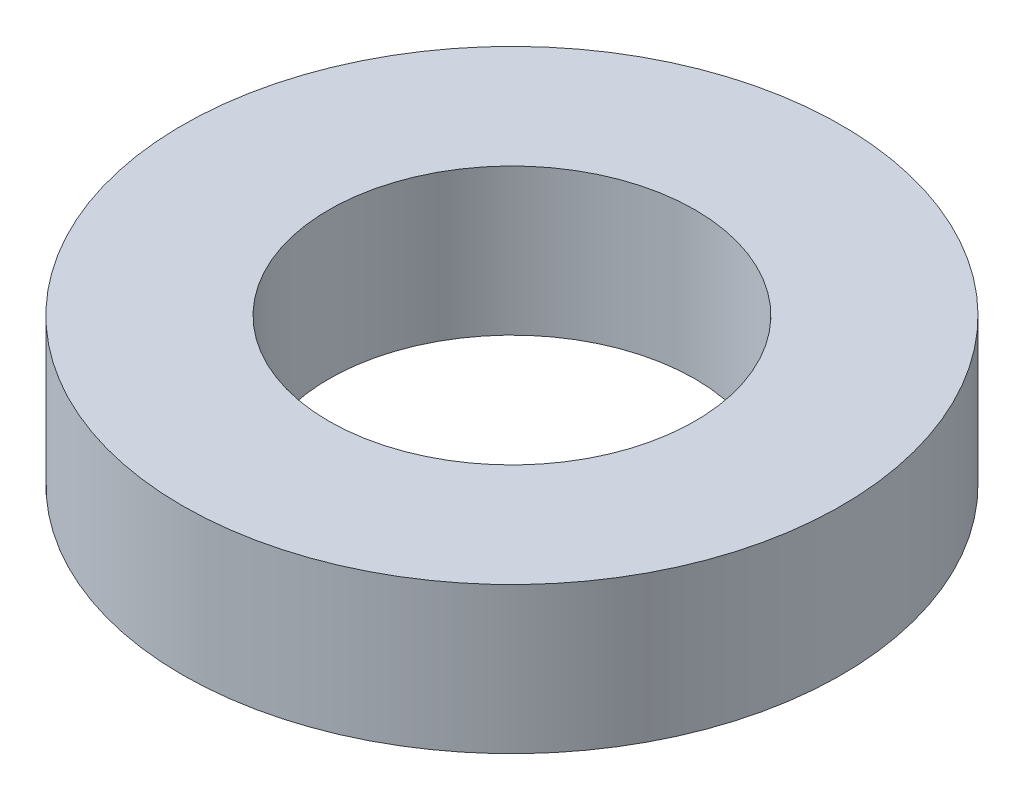
ISO-10303-21;
HEADER;
FILE_DESCRIPTION(('STEP AP214'),'2;1');
FILE_NAME('part.step','',(''),(''),'','','');
FILE_SCHEMA(('AUTOMOTIVE_DESIGN { 1 0 10303 214 1 1 1 1 }'));
ENDSEC;
DATA;
#1=APPLICATION_CONTEXT('core data for automotive mechanical design processes');
#2=APPLICATION_PROTOCOL_DEFINITION('international standard','automotive_design',2000,#1);
#3=PRODUCT_CONTEXT('',#1,'mechanical');
#4=PRODUCT('Part','Part','',(#3));
#5=PRODUCT_RELATED_PRODUCT_CATEGORY('part','',(#4));
#6=PRODUCT_DEFINITION_FORMATION('','',#4);
#7=PRODUCT_DEFINITION_CONTEXT('part definition',#1,'design');
#8=PRODUCT_DEFINITION('design','',#6,#7);
#9=PRODUCT_DEFINITION_SHAPE('','',#8);
#10=(LENGTH_UNIT() NAMED_UNIT(*) SI_UNIT(.MILLI.,.METRE.));
#11=(NAMED_UNIT(*) PLANE_ANGLE_UNIT() SI_UNIT($,.RADIAN.));
#12=(NAMED_UNIT(*) SI_UNIT($,.STERADIAN.) SOLID_ANGLE_UNIT());
#13=UNCERTAINTY_MEASURE_WITH_UNIT(LENGTH_MEASURE(1.E-05),#10,'distance_accuracy_value','');
#14=(GEOMETRIC_REPRESENTATION_CONTEXT(3) GLOBAL_UNCERTAINTY_ASSIGNED_CONTEXT((#13)) GLOBAL_UNIT_ASSIGNED_CONTEXT((#10,
#11,#12)) REPRESENTATION_CONTEXT('',''));
#15=CARTESIAN_POINT('',(0.,0.,0.));
#16=DIRECTION('',(0.,0.,1.));
#17=DIRECTION('',(1.,0.,0.));
#18=AXIS2_PLACEMENT_3D('',#15,#16,#17);
#19=CARTESIAN_POINT('',(0.,1.2,0.));
#20=DIRECTION('',(0.,1.,0.));
#21=DIRECTION('',(0.,0.,1.));
#22=AXIS2_PLACEMENT_3D('',#19,#20,#21);
#23=PLANE('',#22);
#24=CARTESIAN_POINT('',(0.,1.2,0.));
#25=DIRECTION('',(0.,1.,0.));
#26=DIRECTION('',(0.,0.,1.));
#27=AXIS2_PLACEMENT_3D('',#24,#25,#26);
#28=CIRCLE('',#27,2.7);
#29=CARTESIAN_POINT('',(0.,1.2,2.7));
#30=VERTEX_POINT('',#29);
#31=EDGE_CURVE('E10',#30,#30,#28,.T.);
#32=ORIENTED_EDGE('',*,*,#31,.T.);
#33=EDGE_LOOP('',(#32));
#34=FACE_BOUND('',#33,.T.);
#35=CARTESIAN_POINT('',(0.,1.2,0.));
#36=DIRECTION('',(0.,1.,0.));
#37=DIRECTION('',(0.,0.,1.));
#38=AXIS2_PLACEMENT_3D('',#35,#36,#37);
#39=CIRCLE('',#38,1.5);
#40=CARTESIAN_POINT('',(0.,1.2,1.5));
#41=VERTEX_POINT('',#40);
#42=EDGE_CURVE('E54',#41,#41,#39,.T.);
#43=ORIENTED_EDGE('',*,*,#42,.F.);
#44=EDGE_LOOP('',(#43));
#45=FACE_BOUND('',#44,.T.);
#46=ADVANCED_FACE('F41',(#34,#45),#23,.T.);
#47=CARTESIAN_POINT('',(0.,0.,0.));
#48=DIRECTION('',(0.,1.,0.));
#49=DIRECTION('',(0.,0.,1.));
#50=AXIS2_PLACEMENT_3D('',#47,#48,#49);
#51=PLANE('',#50);
#52=CARTESIAN_POINT('',(0.,0.,0.));
#53=DIRECTION('',(0.,1.,0.));
#54=DIRECTION('',(0.,0.,1.));
#55=AXIS2_PLACEMENT_3D('',#52,#53,#54);
#56=CIRCLE('',#55,2.7);
#57=CARTESIAN_POINT('',(0.,0.,2.7));
#58=VERTEX_POINT('',#57);
#59=EDGE_CURVE('E45',#58,#58,#56,.T.);
#60=ORIENTED_EDGE('',*,*,#59,.F.);
#61=EDGE_LOOP('',(#60));
#62=FACE_BOUND('',#61,.T.);
#63=CARTESIAN_POINT('',(0.,0.,0.));
#64=DIRECTION('',(0.,1.,0.));
#65=DIRECTION('',(0.,0.,1.));
#66=AXIS2_PLACEMENT_3D('',#63,#64,#65);
#67=CIRCLE('',#66,1.5);
#68=CARTESIAN_POINT('',(0.,0.,1.5));
#69=VERTEX_POINT('',#68);
#70=EDGE_CURVE('E56',#69,#69,#67,.T.);
#71=ORIENTED_EDGE('',*,*,#70,.T.);
#72=EDGE_LOOP('',(#71));
#73=FACE_BOUND('',#72,.T.);
#74=ADVANCED_FACE('F68',(#62,#73),#51,.F.);
#75=CARTESIAN_POINT('',(0.,1.2,0.));
#76=DIRECTION('',(0.,-1.,0.));
#77=DIRECTION('',(0.,0.,-1.));
#78=AXIS2_PLACEMENT_3D('',#75,#76,#77);
#79=CYLINDRICAL_SURFACE('',#78,2.7);
#80=ORIENTED_EDGE('',*,*,#31,.F.);
#81=EDGE_LOOP('',(#80));
#82=FACE_BOUND('',#81,.T.);
#83=ORIENTED_EDGE('',*,*,#59,.T.);
#84=EDGE_LOOP('',(#83));
#85=FACE_BOUND('',#84,.T.);
#86=ADVANCED_FACE('F43',(#82,#85),#79,.T.);
#87=CARTESIAN_POINT('',(0.,1.2,0.));
#88=DIRECTION('',(0.,-1.,0.));
#89=DIRECTION('',(0.,0.,-1.));
#90=AXIS2_PLACEMENT_3D('',#87,#88,#89);
#91=CYLINDRICAL_SURFACE('',#90,1.5);
#92=ORIENTED_EDGE('',*,*,#42,.T.);
#93=EDGE_LOOP('',(#92));
#94=FACE_BOUND('',#93,.T.);
#95=ORIENTED_EDGE('',*,*,#70,.F.);
#96=EDGE_LOOP('',(#95));
#97=FACE_BOUND('',#96,.T.);
#98=ADVANCED_FACE('F64',(#94,#97),#91,.F.);
#99=CLOSED_SHELL('',(#46,#74,#86,#98));
#100=MANIFOLD_SOLID_BREP('B2',#99);
#101=ADVANCED_BREP_SHAPE_REPRESENTATION('',(#18,#100),#14);
#102=SHAPE_DEFINITION_REPRESENTATION(#9,#101);
ENDSEC;
END-ISO-10303-21;
